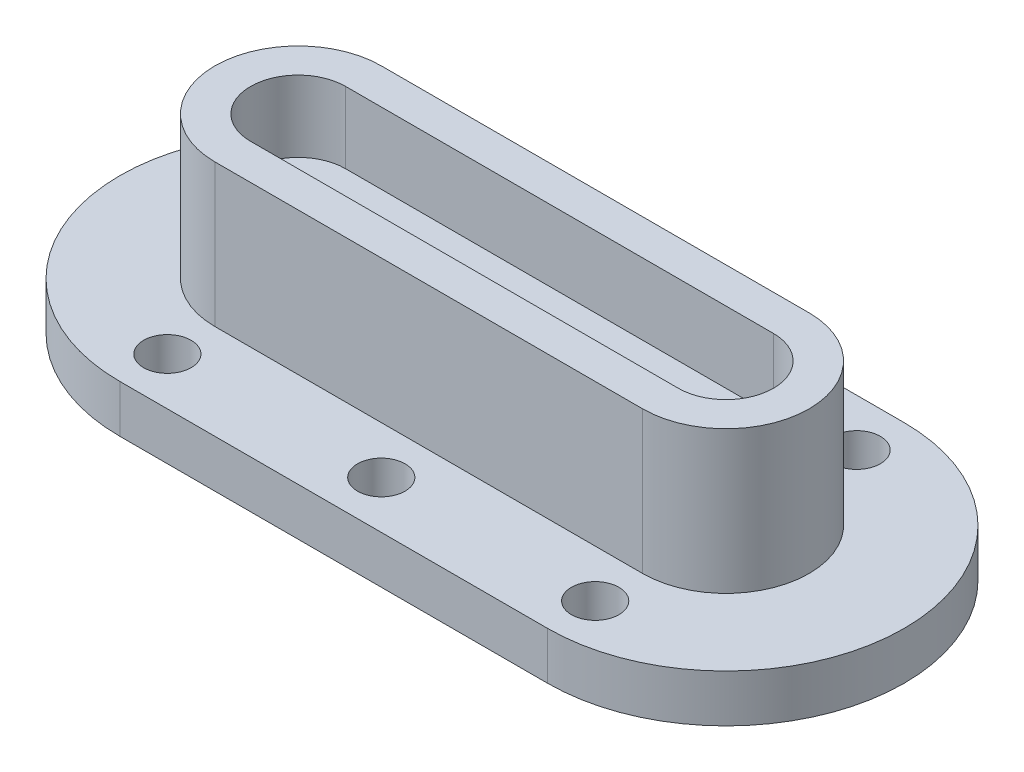
ISO-10303-21;
HEADER;
FILE_DESCRIPTION(('STEP AP214'),'2;1');
FILE_NAME('part.step','',(''),(''),'','','');
FILE_SCHEMA(('AUTOMOTIVE_DESIGN { 1 0 10303 214 1 1 1 1 }'));
ENDSEC;
DATA;
#1=APPLICATION_CONTEXT('core data for automotive mechanical design processes');
#2=APPLICATION_PROTOCOL_DEFINITION('international standard','automotive_design',2000,#1);
#3=PRODUCT_CONTEXT('',#1,'mechanical');
#4=PRODUCT('Part','Part','',(#3));
#5=PRODUCT_RELATED_PRODUCT_CATEGORY('part','',(#4));
#6=PRODUCT_DEFINITION_FORMATION('','',#4);
#7=PRODUCT_DEFINITION_CONTEXT('part definition',#1,'design');
#8=PRODUCT_DEFINITION('design','',#6,#7);
#9=PRODUCT_DEFINITION_SHAPE('','',#8);
#10=(LENGTH_UNIT() NAMED_UNIT(*) SI_UNIT(.MILLI.,.METRE.));
#11=(NAMED_UNIT(*) PLANE_ANGLE_UNIT() SI_UNIT($,.RADIAN.));
#12=(NAMED_UNIT(*) SI_UNIT($,.STERADIAN.) SOLID_ANGLE_UNIT());
#13=UNCERTAINTY_MEASURE_WITH_UNIT(LENGTH_MEASURE(1.E-05),#10,'distance_accuracy_value','');
#14=(GEOMETRIC_REPRESENTATION_CONTEXT(3) GLOBAL_UNCERTAINTY_ASSIGNED_CONTEXT((#13)) GLOBAL_UNIT_ASSIGNED_CONTEXT((#10,
#11,#12)) REPRESENTATION_CONTEXT('',''));
#15=CARTESIAN_POINT('',(0.,0.,0.));
#16=DIRECTION('',(0.,0.,1.));
#17=DIRECTION('',(1.,0.,0.));
#18=AXIS2_PLACEMENT_3D('',#15,#16,#17);
#19=CARTESIAN_POINT('',(0.,20.,-75.));
#20=DIRECTION('',(0.,0.,1.));
#21=DIRECTION('',(1.,0.,0.));
#22=AXIS2_PLACEMENT_3D('',#19,#20,#21);
#23=PLANE('',#22);
#24=DIRECTION('',(-1.,0.,0.));
#25=VECTOR('',#24,1.);
#26=CARTESIAN_POINT('',(0.,0.,-75.));
#27=LINE('',#26,#25);
#28=CARTESIAN_POINT('',(89.9999999999999,0.,-75.));
#29=VERTEX_POINT('',#28);
#30=CARTESIAN_POINT('',(-90.,0.,-75.));
#31=VERTEX_POINT('',#30);
#32=EDGE_CURVE('E262',#29,#31,#27,.T.);
#33=ORIENTED_EDGE('',*,*,#32,.T.);
#34=DIRECTION('',(0.,-1.,0.));
#35=VECTOR('',#34,1.);
#36=CARTESIAN_POINT('',(-90.,20.,-75.));
#37=LINE('',#36,#35);
#38=CARTESIAN_POINT('',(-90.,20.,-75.));
#39=VERTEX_POINT('',#38);
#40=EDGE_CURVE('E11',#39,#31,#37,.T.);
#41=ORIENTED_EDGE('',*,*,#40,.F.);
#42=DIRECTION('',(-1.,0.,0.));
#43=VECTOR('',#42,1.);
#44=CARTESIAN_POINT('',(0.,20.,-75.));
#45=LINE('',#44,#43);
#46=CARTESIAN_POINT('',(89.9999999999999,20.,-75.));
#47=VERTEX_POINT('',#46);
#48=EDGE_CURVE('E237',#47,#39,#45,.T.);
#49=ORIENTED_EDGE('',*,*,#48,.F.);
#50=DIRECTION('',(0.,-1.,0.));
#51=VECTOR('',#50,1.);
#52=CARTESIAN_POINT('',(89.9999999999999,20.,-75.));
#53=LINE('',#52,#51);
#54=EDGE_CURVE('E244',#47,#29,#53,.T.);
#55=ORIENTED_EDGE('',*,*,#54,.T.);
#56=EDGE_LOOP('',(#33,#41,#49,#55));
#57=FACE_BOUND('',#56,.T.);
#58=ADVANCED_FACE('F35',(#57),#23,.F.);
#59=CARTESIAN_POINT('',(-90.,20.,0.));
#60=DIRECTION('',(0.,-1.,0.));
#61=DIRECTION('',(0.,0.,-1.));
#62=AXIS2_PLACEMENT_3D('',#59,#60,#61);
#63=CYLINDRICAL_SURFACE('',#62,75.);
#64=CARTESIAN_POINT('',(-90.,0.,0.));
#65=DIRECTION('',(0.,1.,0.));
#66=DIRECTION('',(0.,0.,1.));
#67=AXIS2_PLACEMENT_3D('',#64,#65,#66);
#68=CIRCLE('',#67,75.);
#69=CARTESIAN_POINT('',(-90.,0.,75.));
#70=VERTEX_POINT('',#69);
#71=EDGE_CURVE('E265',#31,#70,#68,.T.);
#72=ORIENTED_EDGE('',*,*,#71,.T.);
#73=DIRECTION('',(0.,-1.,0.));
#74=VECTOR('',#73,1.);
#75=CARTESIAN_POINT('',(-90.,20.,75.));
#76=LINE('',#75,#74);
#77=CARTESIAN_POINT('',(-90.,20.,75.));
#78=VERTEX_POINT('',#77);
#79=EDGE_CURVE('E43',#78,#70,#76,.T.);
#80=ORIENTED_EDGE('',*,*,#79,.F.);
#81=CARTESIAN_POINT('',(-90.,20.,0.));
#82=DIRECTION('',(0.,1.,0.));
#83=DIRECTION('',(0.,0.,1.));
#84=AXIS2_PLACEMENT_3D('',#81,#82,#83);
#85=CIRCLE('',#84,75.);
#86=EDGE_CURVE('E87',#39,#78,#85,.T.);
#87=ORIENTED_EDGE('',*,*,#86,.F.);
#88=ORIENTED_EDGE('',*,*,#40,.T.);
#89=EDGE_LOOP('',(#72,#80,#87,#88));
#90=FACE_BOUND('',#89,.T.);
#91=ADVANCED_FACE('F285',(#90),#63,.T.);
#92=CARTESIAN_POINT('',(0.,20.,75.));
#93=DIRECTION('',(0.,0.,1.));
#94=DIRECTION('',(1.,0.,0.));
#95=AXIS2_PLACEMENT_3D('',#92,#93,#94);
#96=PLANE('',#95);
#97=DIRECTION('',(-1.,0.,0.));
#98=VECTOR('',#97,1.);
#99=CARTESIAN_POINT('',(0.,0.,75.));
#100=LINE('',#99,#98);
#101=CARTESIAN_POINT('',(90.,0.,75.));
#102=VERTEX_POINT('',#101);
#103=EDGE_CURVE('E268',#102,#70,#100,.T.);
#104=ORIENTED_EDGE('',*,*,#103,.F.);
#105=DIRECTION('',(0.,-1.,0.));
#106=VECTOR('',#105,1.);
#107=CARTESIAN_POINT('',(90.,20.,75.));
#108=LINE('',#107,#106);
#109=CARTESIAN_POINT('',(90.,20.,75.));
#110=VERTEX_POINT('',#109);
#111=EDGE_CURVE('E281',#110,#102,#108,.T.);
#112=ORIENTED_EDGE('',*,*,#111,.F.);
#113=DIRECTION('',(-1.,0.,0.));
#114=VECTOR('',#113,1.);
#115=CARTESIAN_POINT('',(0.,20.,75.));
#116=LINE('',#115,#114);
#117=EDGE_CURVE('E240',#110,#78,#116,.T.);
#118=ORIENTED_EDGE('',*,*,#117,.T.);
#119=ORIENTED_EDGE('',*,*,#79,.T.);
#120=EDGE_LOOP('',(#104,#112,#118,#119));
#121=FACE_BOUND('',#120,.T.);
#122=ADVANCED_FACE('F284',(#121),#96,.T.);
#123=CARTESIAN_POINT('',(0.,20.,6.05223092147341E-13));
#124=DIRECTION('',(0.,-1.,0.));
#125=DIRECTION('',(0.,0.,-1.));
#126=AXIS2_PLACEMENT_3D('',#123,#124,#125);
#127=CYLINDRICAL_SURFACE('',#126,7.50000000000001);
#128=CARTESIAN_POINT('',(0.,0.,6.05223092147341E-13));
#129=DIRECTION('',(0.,1.,0.));
#130=DIRECTION('',(0.,0.,1.));
#131=AXIS2_PLACEMENT_3D('',#128,#129,#130);
#132=CIRCLE('',#131,7.50000000000001);
#133=CARTESIAN_POINT('',(0.,0.,7.50000000000062));
#134=VERTEX_POINT('',#133);
#135=EDGE_CURVE('E275',#134,#134,#132,.T.);
#136=ORIENTED_EDGE('',*,*,#135,.F.);
#137=EDGE_LOOP('',(#136));
#138=FACE_BOUND('',#137,.T.);
#139=CARTESIAN_POINT('',(0.,50.,6.05223092147341E-13));
#140=DIRECTION('',(0.,1.,0.));
#141=DIRECTION('',(0.,0.,1.));
#142=AXIS2_PLACEMENT_3D('',#139,#140,#141);
#143=CIRCLE('',#142,7.50000000000001);
#144=CARTESIAN_POINT('',(0.,50.,7.50000000000062));
#145=VERTEX_POINT('',#144);
#146=EDGE_CURVE('E203',#145,#145,#143,.T.);
#147=ORIENTED_EDGE('',*,*,#146,.T.);
#148=EDGE_LOOP('',(#147));
#149=FACE_BOUND('',#148,.T.);
#150=ADVANCED_FACE('F504',(#138,#149),#127,.F.);
#151=CARTESIAN_POINT('',(-89.9999999999999,20.,1.2336897331391E-12));
#152=DIRECTION('',(0.,-1.,0.));
#153=DIRECTION('',(0.,0.,-1.));
#154=AXIS2_PLACEMENT_3D('',#151,#152,#153);
#155=CYLINDRICAL_SURFACE('',#154,7.50000000000001);
#156=CARTESIAN_POINT('',(-89.9999999999999,0.,1.2336897331391E-12));
#157=DIRECTION('',(0.,1.,0.));
#158=DIRECTION('',(0.,0.,1.));
#159=AXIS2_PLACEMENT_3D('',#156,#157,#158);
#160=CIRCLE('',#159,7.50000000000001);
#161=CARTESIAN_POINT('',(-89.9999999999999,0.,7.50000000000125));
#162=VERTEX_POINT('',#161);
#163=EDGE_CURVE('E272',#162,#162,#160,.T.);
#164=ORIENTED_EDGE('',*,*,#163,.F.);
#165=EDGE_LOOP('',(#164));
#166=FACE_BOUND('',#165,.T.);
#167=CARTESIAN_POINT('',(-89.9999999999999,50.,1.2336897331391E-12));
#168=DIRECTION('',(0.,1.,0.));
#169=DIRECTION('',(0.,0.,1.));
#170=AXIS2_PLACEMENT_3D('',#167,#168,#169);
#171=CIRCLE('',#170,7.50000000000001);
#172=CARTESIAN_POINT('',(-89.9999999999999,50.,7.50000000000125));
#173=VERTEX_POINT('',#172);
#174=EDGE_CURVE('E200',#173,#173,#171,.T.);
#175=ORIENTED_EDGE('',*,*,#174,.T.);
#176=EDGE_LOOP('',(#175));
#177=FACE_BOUND('',#176,.T.);
#178=ADVANCED_FACE('F383',(#166,#177),#155,.F.);
#179=CARTESIAN_POINT('',(90.,20.,0.));
#180=DIRECTION('',(0.,-1.,0.));
#181=DIRECTION('',(0.,0.,-1.));
#182=AXIS2_PLACEMENT_3D('',#179,#180,#181);
#183=CYLINDRICAL_SURFACE('',#182,75.);
#184=CARTESIAN_POINT('',(90.,0.,0.));
#185=DIRECTION('',(0.,1.,0.));
#186=DIRECTION('',(0.,0.,1.));
#187=AXIS2_PLACEMENT_3D('',#184,#185,#186);
#188=CIRCLE('',#187,75.);
#189=EDGE_CURVE('E80',#102,#29,#188,.T.);
#190=ORIENTED_EDGE('',*,*,#189,.T.);
#191=ORIENTED_EDGE('',*,*,#54,.F.);
#192=CARTESIAN_POINT('',(90.,20.,0.));
#193=DIRECTION('',(0.,1.,0.));
#194=DIRECTION('',(0.,0.,1.));
#195=AXIS2_PLACEMENT_3D('',#192,#193,#194);
#196=CIRCLE('',#195,75.);
#197=EDGE_CURVE('E59',#110,#47,#196,.T.);
#198=ORIENTED_EDGE('',*,*,#197,.F.);
#199=ORIENTED_EDGE('',*,*,#111,.T.);
#200=EDGE_LOOP('',(#190,#191,#198,#199));
#201=FACE_BOUND('',#200,.T.);
#202=ADVANCED_FACE('F293',(#201),#183,.T.);
#203=CARTESIAN_POINT('',(-90.0000000000002,20.,-55.));
#204=DIRECTION('',(0.,-1.,0.));
#205=DIRECTION('',(0.,0.,-1.));
#206=AXIS2_PLACEMENT_3D('',#203,#204,#205);
#207=CYLINDRICAL_SURFACE('',#206,9.99999999999999);
#208=CARTESIAN_POINT('',(-90.0000000000002,20.,-55.));
#209=DIRECTION('',(0.,1.,0.));
#210=DIRECTION('',(0.,0.,1.));
#211=AXIS2_PLACEMENT_3D('',#208,#209,#210);
#212=CIRCLE('',#211,9.99999999999999);
#213=CARTESIAN_POINT('',(-90.0000000000002,20.,-45.));
#214=VERTEX_POINT('',#213);
#215=EDGE_CURVE('E234',#214,#214,#212,.T.);
#216=ORIENTED_EDGE('',*,*,#215,.T.);
#217=EDGE_LOOP('',(#216));
#218=FACE_BOUND('',#217,.T.);
#219=CARTESIAN_POINT('',(-90.0000000000002,0.,-55.));
#220=DIRECTION('',(0.,1.,0.));
#221=DIRECTION('',(0.,0.,1.));
#222=AXIS2_PLACEMENT_3D('',#219,#220,#221);
#223=CIRCLE('',#222,9.99999999999999);
#224=CARTESIAN_POINT('',(-90.0000000000002,0.,-45.));
#225=VERTEX_POINT('',#224);
#226=EDGE_CURVE('E259',#225,#225,#223,.T.);
#227=ORIENTED_EDGE('',*,*,#226,.F.);
#228=EDGE_LOOP('',(#227));
#229=FACE_BOUND('',#228,.T.);
#230=ADVANCED_FACE('F318',(#218,#229),#207,.F.);
#231=CARTESIAN_POINT('',(-89.9999999999995,20.,55.));
#232=DIRECTION('',(0.,-1.,0.));
#233=DIRECTION('',(0.,0.,-1.));
#234=AXIS2_PLACEMENT_3D('',#231,#232,#233);
#235=CYLINDRICAL_SURFACE('',#234,10.);
#236=CARTESIAN_POINT('',(-89.9999999999995,20.,55.));
#237=DIRECTION('',(0.,1.,0.));
#238=DIRECTION('',(0.,0.,1.));
#239=AXIS2_PLACEMENT_3D('',#236,#237,#238);
#240=CIRCLE('',#239,10.);
#241=CARTESIAN_POINT('',(-89.9999999999995,20.,65.));
#242=VERTEX_POINT('',#241);
#243=EDGE_CURVE('E231',#242,#242,#240,.T.);
#244=ORIENTED_EDGE('',*,*,#243,.T.);
#245=EDGE_LOOP('',(#244));
#246=FACE_BOUND('',#245,.T.);
#247=CARTESIAN_POINT('',(-89.9999999999995,0.,55.));
#248=DIRECTION('',(0.,1.,0.));
#249=DIRECTION('',(0.,0.,1.));
#250=AXIS2_PLACEMENT_3D('',#247,#248,#249);
#251=CIRCLE('',#250,10.);
#252=CARTESIAN_POINT('',(-89.9999999999995,0.,65.));
#253=VERTEX_POINT('',#252);
#254=EDGE_CURVE('E256',#253,#253,#251,.T.);
#255=ORIENTED_EDGE('',*,*,#254,.F.);
#256=EDGE_LOOP('',(#255));
#257=FACE_BOUND('',#256,.T.);
#258=ADVANCED_FACE('F321',(#246,#257),#235,.F.);
#259=CARTESIAN_POINT('',(-1.94289029309402E-13,20.,-55.));
#260=DIRECTION('',(0.,-1.,0.));
#261=DIRECTION('',(0.,0.,-1.));
#262=AXIS2_PLACEMENT_3D('',#259,#260,#261);
#263=CYLINDRICAL_SURFACE('',#262,9.99999999999999);
#264=CARTESIAN_POINT('',(-1.94289029309402E-13,20.,-55.));
#265=DIRECTION('',(0.,1.,0.));
#266=DIRECTION('',(0.,0.,1.));
#267=AXIS2_PLACEMENT_3D('',#264,#265,#266);
#268=CIRCLE('',#267,9.99999999999999);
#269=CARTESIAN_POINT('',(-1.94289029309402E-13,20.,-45.));
#270=VERTEX_POINT('',#269);
#271=EDGE_CURVE('E228',#270,#270,#268,.T.);
#272=ORIENTED_EDGE('',*,*,#271,.T.);
#273=EDGE_LOOP('',(#272));
#274=FACE_BOUND('',#273,.T.);
#275=CARTESIAN_POINT('',(-1.94289029309402E-13,0.,-55.));
#276=DIRECTION('',(0.,1.,0.));
#277=DIRECTION('',(0.,0.,1.));
#278=AXIS2_PLACEMENT_3D('',#275,#276,#277);
#279=CIRCLE('',#278,9.99999999999999);
#280=CARTESIAN_POINT('',(-1.94289029309402E-13,0.,-45.));
#281=VERTEX_POINT('',#280);
#282=EDGE_CURVE('E253',#281,#281,#279,.T.);
#283=ORIENTED_EDGE('',*,*,#282,.F.);
#284=EDGE_LOOP('',(#283));
#285=FACE_BOUND('',#284,.T.);
#286=ADVANCED_FACE('F325',(#274,#285),#263,.F.);
#287=CARTESIAN_POINT('',(5.82867087928207E-13,20.,55.));
#288=DIRECTION('',(0.,-1.,0.));
#289=DIRECTION('',(0.,0.,-1.));
#290=AXIS2_PLACEMENT_3D('',#287,#288,#289);
#291=CYLINDRICAL_SURFACE('',#290,9.99999999999999);
#292=CARTESIAN_POINT('',(5.82867087928207E-13,20.,55.));
#293=DIRECTION('',(0.,1.,0.));
#294=DIRECTION('',(0.,0.,1.));
#295=AXIS2_PLACEMENT_3D('',#292,#293,#294);
#296=CIRCLE('',#295,9.99999999999999);
#297=CARTESIAN_POINT('',(5.82867087928207E-13,20.,65.));
#298=VERTEX_POINT('',#297);
#299=EDGE_CURVE('E225',#298,#298,#296,.T.);
#300=ORIENTED_EDGE('',*,*,#299,.T.);
#301=EDGE_LOOP('',(#300));
#302=FACE_BOUND('',#301,.T.);
#303=CARTESIAN_POINT('',(5.82867087928207E-13,0.,55.));
#304=DIRECTION('',(0.,1.,0.));
#305=DIRECTION('',(0.,0.,1.));
#306=AXIS2_PLACEMENT_3D('',#303,#304,#305);
#307=CIRCLE('',#306,9.99999999999999);
#308=CARTESIAN_POINT('',(5.82867087928207E-13,0.,65.));
#309=VERTEX_POINT('',#308);
#310=EDGE_CURVE('E250',#309,#309,#307,.T.);
#311=ORIENTED_EDGE('',*,*,#310,.F.);
#312=EDGE_LOOP('',(#311));
#313=FACE_BOUND('',#312,.T.);
#314=ADVANCED_FACE('F329',(#302,#313),#291,.F.);
#315=CARTESIAN_POINT('',(89.9999999999998,20.,-55.));
#316=DIRECTION('',(0.,-1.,0.));
#317=DIRECTION('',(0.,0.,-1.));
#318=AXIS2_PLACEMENT_3D('',#315,#316,#317);
#319=CYLINDRICAL_SURFACE('',#318,9.99999999999999);
#320=CARTESIAN_POINT('',(89.9999999999998,20.,-55.));
#321=DIRECTION('',(0.,1.,0.));
#322=DIRECTION('',(0.,0.,1.));
#323=AXIS2_PLACEMENT_3D('',#320,#321,#322);
#324=CIRCLE('',#323,9.99999999999999);
#325=CARTESIAN_POINT('',(89.9999999999998,20.,-45.));
#326=VERTEX_POINT('',#325);
#327=EDGE_CURVE('E221',#326,#326,#324,.T.);
#328=ORIENTED_EDGE('',*,*,#327,.T.);
#329=EDGE_LOOP('',(#328));
#330=FACE_BOUND('',#329,.T.);
#331=CARTESIAN_POINT('',(89.9999999999998,0.,-55.));
#332=DIRECTION('',(0.,1.,0.));
#333=DIRECTION('',(0.,0.,1.));
#334=AXIS2_PLACEMENT_3D('',#331,#332,#333);
#335=CIRCLE('',#334,9.99999999999999);
#336=CARTESIAN_POINT('',(89.9999999999998,0.,-45.));
#337=VERTEX_POINT('',#336);
#338=EDGE_CURVE('E247',#337,#337,#335,.T.);
#339=ORIENTED_EDGE('',*,*,#338,.F.);
#340=EDGE_LOOP('',(#339));
#341=FACE_BOUND('',#340,.T.);
#342=ADVANCED_FACE('F332',(#330,#341),#319,.F.);
#343=CARTESIAN_POINT('',(90.0000000000006,20.,55.));
#344=DIRECTION('',(0.,-1.,0.));
#345=DIRECTION('',(0.,0.,-1.));
#346=AXIS2_PLACEMENT_3D('',#343,#344,#345);
#347=CYLINDRICAL_SURFACE('',#346,9.99999999999999);
#348=CARTESIAN_POINT('',(90.0000000000006,20.,55.));
#349=DIRECTION('',(0.,1.,0.));
#350=DIRECTION('',(0.,0.,1.));
#351=AXIS2_PLACEMENT_3D('',#348,#349,#350);
#352=CIRCLE('',#351,9.99999999999999);
#353=CARTESIAN_POINT('',(90.0000000000006,20.,65.));
#354=VERTEX_POINT('',#353);
#355=EDGE_CURVE('E218',#354,#354,#352,.T.);
#356=ORIENTED_EDGE('',*,*,#355,.T.);
#357=EDGE_LOOP('',(#356));
#358=FACE_BOUND('',#357,.T.);
#359=CARTESIAN_POINT('',(90.0000000000006,0.,55.));
#360=DIRECTION('',(0.,1.,0.));
#361=DIRECTION('',(0.,0.,1.));
#362=AXIS2_PLACEMENT_3D('',#359,#360,#361);
#363=CIRCLE('',#362,9.99999999999999);
#364=CARTESIAN_POINT('',(90.0000000000006,0.,65.));
#365=VERTEX_POINT('',#364);
#366=EDGE_CURVE('E217',#365,#365,#363,.T.);
#367=ORIENTED_EDGE('',*,*,#366,.F.);
#368=EDGE_LOOP('',(#367));
#369=FACE_BOUND('',#368,.T.);
#370=ADVANCED_FACE('F37',(#358,#369),#347,.F.);
#371=CARTESIAN_POINT('',(90.0000000000001,20.,0.));
#372=DIRECTION('',(0.,-1.,0.));
#373=DIRECTION('',(0.,0.,-1.));
#374=AXIS2_PLACEMENT_3D('',#371,#372,#373);
#375=CYLINDRICAL_SURFACE('',#374,7.50000000000001);
#376=CARTESIAN_POINT('',(90.0000000000001,0.,0.));
#377=DIRECTION('',(0.,1.,0.));
#378=DIRECTION('',(0.,0.,1.));
#379=AXIS2_PLACEMENT_3D('',#376,#377,#378);
#380=CIRCLE('',#379,7.50000000000001);
#381=CARTESIAN_POINT('',(90.0000000000001,0.,7.49999999999999));
#382=VERTEX_POINT('',#381);
#383=EDGE_CURVE('E222',#382,#382,#380,.T.);
#384=ORIENTED_EDGE('',*,*,#383,.F.);
#385=EDGE_LOOP('',(#384));
#386=FACE_BOUND('',#385,.T.);
#387=CARTESIAN_POINT('',(90.0000000000001,50.,0.));
#388=DIRECTION('',(0.,1.,0.));
#389=DIRECTION('',(0.,0.,1.));
#390=AXIS2_PLACEMENT_3D('',#387,#388,#389);
#391=CIRCLE('',#390,7.50000000000001);
#392=CARTESIAN_POINT('',(90.0000000000001,50.,7.49999999999999));
#393=VERTEX_POINT('',#392);
#394=EDGE_CURVE('E206',#393,#393,#391,.T.);
#395=ORIENTED_EDGE('',*,*,#394,.T.);
#396=EDGE_LOOP('',(#395));
#397=FACE_BOUND('',#396,.T.);
#398=ADVANCED_FACE('F296',(#386,#397),#375,.F.);
#399=CARTESIAN_POINT('',(0.,20.,0.));
#400=DIRECTION('',(0.,1.,0.));
#401=DIRECTION('',(0.,0.,1.));
#402=AXIS2_PLACEMENT_3D('',#399,#400,#401);
#403=PLANE('',#402);
#404=CARTESIAN_POINT('',(-90.,20.,0.));
#405=DIRECTION('',(0.,1.,0.));
#406=DIRECTION('',(0.,0.,1.));
#407=AXIS2_PLACEMENT_3D('',#404,#405,#406);
#408=CIRCLE('',#407,35.);
#409=CARTESIAN_POINT('',(-90.,20.,35.));
#410=VERTEX_POINT('',#409);
#411=CARTESIAN_POINT('',(-90.,20.,-35.));
#412=VERTEX_POINT('',#411);
#413=EDGE_CURVE('E194',#410,#412,#408,.F.);
#414=ORIENTED_EDGE('',*,*,#413,.T.);
#415=DIRECTION('',(1.,0.,0.));
#416=VECTOR('',#415,1.);
#417=CARTESIAN_POINT('',(0.,20.,-35.));
#418=LINE('',#417,#416);
#419=CARTESIAN_POINT('',(90.,20.,-35.));
#420=VERTEX_POINT('',#419);
#421=EDGE_CURVE('E197',#412,#420,#418,.T.);
#422=ORIENTED_EDGE('',*,*,#421,.T.);
#423=CARTESIAN_POINT('',(90.,20.,0.));
#424=DIRECTION('',(0.,1.,0.));
#425=DIRECTION('',(0.,0.,1.));
#426=AXIS2_PLACEMENT_3D('',#423,#424,#425);
#427=CIRCLE('',#426,35.);
#428=CARTESIAN_POINT('',(90.,20.,35.));
#429=VERTEX_POINT('',#428);
#430=EDGE_CURVE('E184',#420,#429,#427,.F.);
#431=ORIENTED_EDGE('',*,*,#430,.T.);
#432=DIRECTION('',(1.,0.,0.));
#433=VECTOR('',#432,1.);
#434=CARTESIAN_POINT('',(0.,20.,35.));
#435=LINE('',#434,#433);
#436=EDGE_CURVE('E192',#410,#429,#435,.T.);
#437=ORIENTED_EDGE('',*,*,#436,.F.);
#438=EDGE_LOOP('',(#414,#422,#431,#437));
#439=FACE_BOUND('',#438,.T.);
#440=ORIENTED_EDGE('',*,*,#355,.F.);
#441=EDGE_LOOP('',(#440));
#442=FACE_BOUND('',#441,.T.);
#443=ORIENTED_EDGE('',*,*,#327,.F.);
#444=EDGE_LOOP('',(#443));
#445=FACE_BOUND('',#444,.T.);
#446=ORIENTED_EDGE('',*,*,#299,.F.);
#447=EDGE_LOOP('',(#446));
#448=FACE_BOUND('',#447,.T.);
#449=ORIENTED_EDGE('',*,*,#271,.F.);
#450=EDGE_LOOP('',(#449));
#451=FACE_BOUND('',#450,.T.);
#452=ORIENTED_EDGE('',*,*,#243,.F.);
#453=EDGE_LOOP('',(#452));
#454=FACE_BOUND('',#453,.T.);
#455=ORIENTED_EDGE('',*,*,#215,.F.);
#456=EDGE_LOOP('',(#455));
#457=FACE_BOUND('',#456,.T.);
#458=ORIENTED_EDGE('',*,*,#48,.T.);
#459=ORIENTED_EDGE('',*,*,#86,.T.);
#460=ORIENTED_EDGE('',*,*,#117,.F.);
#461=ORIENTED_EDGE('',*,*,#197,.T.);
#462=EDGE_LOOP('',(#458,#459,#460,#461));
#463=FACE_BOUND('',#462,.T.);
#464=ADVANCED_FACE('F294',(#439,#442,#445,#448,#451,#454,#457,#463),#403,.T.);
#465=CARTESIAN_POINT('',(0.,0.,0.));
#466=DIRECTION('',(0.,1.,0.));
#467=DIRECTION('',(0.,0.,1.));
#468=AXIS2_PLACEMENT_3D('',#465,#466,#467);
#469=PLANE('',#468);
#470=ORIENTED_EDGE('',*,*,#366,.T.);
#471=EDGE_LOOP('',(#470));
#472=FACE_BOUND('',#471,.T.);
#473=ORIENTED_EDGE('',*,*,#338,.T.);
#474=EDGE_LOOP('',(#473));
#475=FACE_BOUND('',#474,.T.);
#476=ORIENTED_EDGE('',*,*,#310,.T.);
#477=EDGE_LOOP('',(#476));
#478=FACE_BOUND('',#477,.T.);
#479=ORIENTED_EDGE('',*,*,#282,.T.);
#480=EDGE_LOOP('',(#479));
#481=FACE_BOUND('',#480,.T.);
#482=ORIENTED_EDGE('',*,*,#254,.T.);
#483=EDGE_LOOP('',(#482));
#484=FACE_BOUND('',#483,.T.);
#485=ORIENTED_EDGE('',*,*,#226,.T.);
#486=EDGE_LOOP('',(#485));
#487=FACE_BOUND('',#486,.T.);
#488=ORIENTED_EDGE('',*,*,#32,.F.);
#489=ORIENTED_EDGE('',*,*,#189,.F.);
#490=ORIENTED_EDGE('',*,*,#103,.T.);
#491=ORIENTED_EDGE('',*,*,#71,.F.);
#492=EDGE_LOOP('',(#488,#489,#490,#491));
#493=FACE_BOUND('',#492,.T.);
#494=ORIENTED_EDGE('',*,*,#383,.T.);
#495=EDGE_LOOP('',(#494));
#496=FACE_BOUND('',#495,.T.);
#497=ORIENTED_EDGE('',*,*,#135,.T.);
#498=EDGE_LOOP('',(#497));
#499=FACE_BOUND('',#498,.T.);
#500=ORIENTED_EDGE('',*,*,#163,.T.);
#501=EDGE_LOOP('',(#500));
#502=FACE_BOUND('',#501,.T.);
#503=ADVANCED_FACE('F289',(#472,#475,#478,#481,#484,#487,#493,#496,#499,#502),#469,.F.);
#504=CARTESIAN_POINT('',(0.,50.,0.));
#505=DIRECTION('',(0.,1.,0.));
#506=DIRECTION('',(0.,0.,1.));
#507=AXIS2_PLACEMENT_3D('',#504,#505,#506);
#508=PLANE('',#507);
#509=ORIENTED_EDGE('',*,*,#174,.F.);
#510=EDGE_LOOP('',(#509));
#511=FACE_BOUND('',#510,.T.);
#512=ORIENTED_EDGE('',*,*,#146,.F.);
#513=EDGE_LOOP('',(#512));
#514=FACE_BOUND('',#513,.T.);
#515=ORIENTED_EDGE('',*,*,#394,.F.);
#516=EDGE_LOOP('',(#515));
#517=FACE_BOUND('',#516,.T.);
#518=DIRECTION('',(-1.,0.,0.));
#519=VECTOR('',#518,1.);
#520=CARTESIAN_POINT('',(0.,50.,-20.));
#521=LINE('',#520,#519);
#522=CARTESIAN_POINT('',(90.,50.,-20.));
#523=VERTEX_POINT('',#522);
#524=CARTESIAN_POINT('',(-90.,50.,-20.));
#525=VERTEX_POINT('',#524);
#526=EDGE_CURVE('E209',#523,#525,#521,.T.);
#527=ORIENTED_EDGE('',*,*,#526,.T.);
#528=CARTESIAN_POINT('',(-90.,50.,0.));
#529=DIRECTION('',(0.,1.,0.));
#530=DIRECTION('',(0.,0.,1.));
#531=AXIS2_PLACEMENT_3D('',#528,#529,#530);
#532=CIRCLE('',#531,20.);
#533=CARTESIAN_POINT('',(-90.,50.,20.));
#534=VERTEX_POINT('',#533);
#535=EDGE_CURVE('E139',#525,#534,#532,.T.);
#536=ORIENTED_EDGE('',*,*,#535,.T.);
#537=DIRECTION('',(-1.,0.,0.));
#538=VECTOR('',#537,1.);
#539=CARTESIAN_POINT('',(0.,50.,20.));
#540=LINE('',#539,#538);
#541=CARTESIAN_POINT('',(90.,50.,20.));
#542=VERTEX_POINT('',#541);
#543=EDGE_CURVE('E212',#542,#534,#540,.T.);
#544=ORIENTED_EDGE('',*,*,#543,.F.);
#545=CARTESIAN_POINT('',(90.,50.,0.));
#546=DIRECTION('',(0.,1.,0.));
#547=DIRECTION('',(0.,0.,1.));
#548=AXIS2_PLACEMENT_3D('',#545,#546,#547);
#549=CIRCLE('',#548,20.);
#550=EDGE_CURVE('E215',#542,#523,#549,.T.);
#551=ORIENTED_EDGE('',*,*,#550,.T.);
#552=EDGE_LOOP('',(#527,#536,#544,#551));
#553=FACE_BOUND('',#552,.T.);
#554=ADVANCED_FACE('F303',(#511,#514,#517,#553),#508,.T.);
#555=CARTESIAN_POINT('',(0.,80.,-35.));
#556=DIRECTION('',(0.,0.,1.));
#557=DIRECTION('',(1.,0.,0.));
#558=AXIS2_PLACEMENT_3D('',#555,#556,#557);
#559=PLANE('',#558);
#560=ORIENTED_EDGE('',*,*,#421,.F.);
#561=DIRECTION('',(0.,-1.,0.));
#562=VECTOR('',#561,1.);
#563=CARTESIAN_POINT('',(-90.,80.,-35.));
#564=LINE('',#563,#562);
#565=CARTESIAN_POINT('',(-90.,80.,-35.));
#566=VERTEX_POINT('',#565);
#567=EDGE_CURVE('E181',#566,#412,#564,.T.);
#568=ORIENTED_EDGE('',*,*,#567,.F.);
#569=DIRECTION('',(-1.,0.,0.));
#570=VECTOR('',#569,1.);
#571=CARTESIAN_POINT('',(0.,80.,-35.));
#572=LINE('',#571,#570);
#573=CARTESIAN_POINT('',(90.,80.,-35.));
#574=VERTEX_POINT('',#573);
#575=EDGE_CURVE('E164',#574,#566,#572,.T.);
#576=ORIENTED_EDGE('',*,*,#575,.F.);
#577=DIRECTION('',(0.,-1.,0.));
#578=VECTOR('',#577,1.);
#579=CARTESIAN_POINT('',(90.,80.,-35.));
#580=LINE('',#579,#578);
#581=EDGE_CURVE('E143',#574,#420,#580,.T.);
#582=ORIENTED_EDGE('',*,*,#581,.T.);
#583=EDGE_LOOP('',(#560,#568,#576,#582));
#584=FACE_BOUND('',#583,.T.);
#585=ADVANCED_FACE('F403',(#584),#559,.F.);
#586=CARTESIAN_POINT('',(-90.,80.,0.));
#587=DIRECTION('',(0.,-1.,0.));
#588=DIRECTION('',(0.,0.,-1.));
#589=AXIS2_PLACEMENT_3D('',#586,#587,#588);
#590=CYLINDRICAL_SURFACE('',#589,35.);
#591=ORIENTED_EDGE('',*,*,#413,.F.);
#592=DIRECTION('',(0.,-1.,0.));
#593=VECTOR('',#592,1.);
#594=CARTESIAN_POINT('',(-90.,80.,35.));
#595=LINE('',#594,#593);
#596=CARTESIAN_POINT('',(-90.,80.,35.));
#597=VERTEX_POINT('',#596);
#598=EDGE_CURVE('E178',#597,#410,#595,.T.);
#599=ORIENTED_EDGE('',*,*,#598,.F.);
#600=CARTESIAN_POINT('',(-90.,80.,0.));
#601=DIRECTION('',(0.,1.,0.));
#602=DIRECTION('',(0.,0.,1.));
#603=AXIS2_PLACEMENT_3D('',#600,#601,#602);
#604=CIRCLE('',#603,35.);
#605=EDGE_CURVE('E167',#566,#597,#604,.T.);
#606=ORIENTED_EDGE('',*,*,#605,.F.);
#607=ORIENTED_EDGE('',*,*,#567,.T.);
#608=EDGE_LOOP('',(#591,#599,#606,#607));
#609=FACE_BOUND('',#608,.T.);
#610=ADVANCED_FACE('F412',(#609),#590,.T.);
#611=CARTESIAN_POINT('',(0.,80.,35.));
#612=DIRECTION('',(0.,0.,1.));
#613=DIRECTION('',(1.,0.,0.));
#614=AXIS2_PLACEMENT_3D('',#611,#612,#613);
#615=PLANE('',#614);
#616=ORIENTED_EDGE('',*,*,#598,.T.);
#617=ORIENTED_EDGE('',*,*,#436,.T.);
#618=DIRECTION('',(0.,-1.,0.));
#619=VECTOR('',#618,1.);
#620=CARTESIAN_POINT('',(90.,80.,35.));
#621=LINE('',#620,#619);
#622=CARTESIAN_POINT('',(90.,80.,35.));
#623=VERTEX_POINT('',#622);
#624=EDGE_CURVE('E50',#623,#429,#621,.T.);
#625=ORIENTED_EDGE('',*,*,#624,.F.);
#626=DIRECTION('',(-1.,0.,0.));
#627=VECTOR('',#626,1.);
#628=CARTESIAN_POINT('',(0.,80.,35.));
#629=LINE('',#628,#627);
#630=EDGE_CURVE('E169',#623,#597,#629,.T.);
#631=ORIENTED_EDGE('',*,*,#630,.T.);
#632=EDGE_LOOP('',(#616,#617,#625,#631));
#633=FACE_BOUND('',#632,.T.);
#634=ADVANCED_FACE('F422',(#633),#615,.T.);
#635=CARTESIAN_POINT('',(-90.,80.,0.));
#636=DIRECTION('',(0.,-1.,0.));
#637=DIRECTION('',(0.,0.,-1.));
#638=AXIS2_PLACEMENT_3D('',#635,#636,#637);
#639=CYLINDRICAL_SURFACE('',#638,20.);
#640=DIRECTION('',(0.,-1.,0.));
#641=VECTOR('',#640,1.);
#642=CARTESIAN_POINT('',(-90.,80.,20.));
#643=LINE('',#642,#641);
#644=CARTESIAN_POINT('',(-90.,80.,20.));
#645=VERTEX_POINT('',#644);
#646=EDGE_CURVE('E174',#645,#534,#643,.T.);
#647=ORIENTED_EDGE('',*,*,#646,.T.);
#648=ORIENTED_EDGE('',*,*,#535,.F.);
#649=DIRECTION('',(0.,-1.,0.));
#650=VECTOR('',#649,1.);
#651=CARTESIAN_POINT('',(-90.,80.,-20.));
#652=LINE('',#651,#650);
#653=CARTESIAN_POINT('',(-90.,80.,-20.));
#654=VERTEX_POINT('',#653);
#655=EDGE_CURVE('E134',#654,#525,#652,.T.);
#656=ORIENTED_EDGE('',*,*,#655,.F.);
#657=CARTESIAN_POINT('',(-90.,80.,0.));
#658=DIRECTION('',(0.,1.,0.));
#659=DIRECTION('',(0.,0.,1.));
#660=AXIS2_PLACEMENT_3D('',#657,#658,#659);
#661=CIRCLE('',#660,20.);
#662=EDGE_CURVE('E138',#654,#645,#661,.T.);
#663=ORIENTED_EDGE('',*,*,#662,.T.);
#664=EDGE_LOOP('',(#647,#648,#656,#663));
#665=FACE_BOUND('',#664,.T.);
#666=ADVANCED_FACE('F137',(#665),#639,.F.);
#667=CARTESIAN_POINT('',(0.,80.,-20.));
#668=DIRECTION('',(0.,0.,1.));
#669=DIRECTION('',(1.,0.,0.));
#670=AXIS2_PLACEMENT_3D('',#667,#668,#669);
#671=PLANE('',#670);
#672=ORIENTED_EDGE('',*,*,#655,.T.);
#673=ORIENTED_EDGE('',*,*,#526,.F.);
#674=DIRECTION('',(0.,-1.,0.));
#675=VECTOR('',#674,1.);
#676=CARTESIAN_POINT('',(90.,80.,-20.));
#677=LINE('',#676,#675);
#678=CARTESIAN_POINT('',(90.,80.,-20.));
#679=VERTEX_POINT('',#678);
#680=EDGE_CURVE('E144',#679,#523,#677,.T.);
#681=ORIENTED_EDGE('',*,*,#680,.F.);
#682=DIRECTION('',(-1.,0.,0.));
#683=VECTOR('',#682,1.);
#684=CARTESIAN_POINT('',(0.,80.,-20.));
#685=LINE('',#684,#683);
#686=EDGE_CURVE('E151',#679,#654,#685,.T.);
#687=ORIENTED_EDGE('',*,*,#686,.T.);
#688=EDGE_LOOP('',(#672,#673,#681,#687));
#689=FACE_BOUND('',#688,.T.);
#690=ADVANCED_FACE('F157',(#689),#671,.T.);
#691=CARTESIAN_POINT('',(90.,80.,0.));
#692=DIRECTION('',(0.,-1.,0.));
#693=DIRECTION('',(0.,0.,-1.));
#694=AXIS2_PLACEMENT_3D('',#691,#692,#693);
#695=CYLINDRICAL_SURFACE('',#694,20.);
#696=ORIENTED_EDGE('',*,*,#680,.T.);
#697=ORIENTED_EDGE('',*,*,#550,.F.);
#698=DIRECTION('',(0.,-1.,0.));
#699=VECTOR('',#698,1.);
#700=CARTESIAN_POINT('',(90.,80.,20.));
#701=LINE('',#700,#699);
#702=CARTESIAN_POINT('',(90.,80.,20.));
#703=VERTEX_POINT('',#702);
#704=EDGE_CURVE('E186',#703,#542,#701,.T.);
#705=ORIENTED_EDGE('',*,*,#704,.F.);
#706=CARTESIAN_POINT('',(90.,80.,0.));
#707=DIRECTION('',(0.,1.,0.));
#708=DIRECTION('',(0.,0.,1.));
#709=AXIS2_PLACEMENT_3D('',#706,#707,#708);
#710=CIRCLE('',#709,20.);
#711=EDGE_CURVE('E159',#703,#679,#710,.T.);
#712=ORIENTED_EDGE('',*,*,#711,.T.);
#713=EDGE_LOOP('',(#696,#697,#705,#712));
#714=FACE_BOUND('',#713,.T.);
#715=ADVANCED_FACE('F449',(#714),#695,.F.);
#716=CARTESIAN_POINT('',(0.,80.,20.));
#717=DIRECTION('',(0.,0.,1.));
#718=DIRECTION('',(1.,0.,0.));
#719=AXIS2_PLACEMENT_3D('',#716,#717,#718);
#720=PLANE('',#719);
#721=ORIENTED_EDGE('',*,*,#543,.T.);
#722=ORIENTED_EDGE('',*,*,#646,.F.);
#723=DIRECTION('',(-1.,0.,0.));
#724=VECTOR('',#723,1.);
#725=CARTESIAN_POINT('',(0.,80.,20.));
#726=LINE('',#725,#724);
#727=EDGE_CURVE('E154',#703,#645,#726,.T.);
#728=ORIENTED_EDGE('',*,*,#727,.F.);
#729=ORIENTED_EDGE('',*,*,#704,.T.);
#730=EDGE_LOOP('',(#721,#722,#728,#729));
#731=FACE_BOUND('',#730,.T.);
#732=ADVANCED_FACE('F458',(#731),#720,.F.);
#733=CARTESIAN_POINT('',(90.,80.,0.));
#734=DIRECTION('',(0.,-1.,0.));
#735=DIRECTION('',(0.,0.,-1.));
#736=AXIS2_PLACEMENT_3D('',#733,#734,#735);
#737=CYLINDRICAL_SURFACE('',#736,35.);
#738=ORIENTED_EDGE('',*,*,#430,.F.);
#739=ORIENTED_EDGE('',*,*,#581,.F.);
#740=CARTESIAN_POINT('',(90.,80.,0.));
#741=DIRECTION('',(0.,1.,0.));
#742=DIRECTION('',(0.,0.,1.));
#743=AXIS2_PLACEMENT_3D('',#740,#741,#742);
#744=CIRCLE('',#743,35.);
#745=EDGE_CURVE('E172',#623,#574,#744,.T.);
#746=ORIENTED_EDGE('',*,*,#745,.F.);
#747=ORIENTED_EDGE('',*,*,#624,.T.);
#748=EDGE_LOOP('',(#738,#739,#746,#747));
#749=FACE_BOUND('',#748,.T.);
#750=ADVANCED_FACE('F468',(#749),#737,.T.);
#751=CARTESIAN_POINT('',(0.,80.,0.));
#752=DIRECTION('',(0.,1.,0.));
#753=DIRECTION('',(0.,0.,1.));
#754=AXIS2_PLACEMENT_3D('',#751,#752,#753);
#755=PLANE('',#754);
#756=ORIENTED_EDGE('',*,*,#662,.F.);
#757=ORIENTED_EDGE('',*,*,#686,.F.);
#758=ORIENTED_EDGE('',*,*,#711,.F.);
#759=ORIENTED_EDGE('',*,*,#727,.T.);
#760=EDGE_LOOP('',(#756,#757,#758,#759));
#761=FACE_BOUND('',#760,.T.);
#762=ORIENTED_EDGE('',*,*,#575,.T.);
#763=ORIENTED_EDGE('',*,*,#605,.T.);
#764=ORIENTED_EDGE('',*,*,#630,.F.);
#765=ORIENTED_EDGE('',*,*,#745,.T.);
#766=EDGE_LOOP('',(#762,#763,#764,#765));
#767=FACE_BOUND('',#766,.T.);
#768=ADVANCED_FACE('F148',(#761,#767),#755,.T.);
#769=CLOSED_SHELL('',(#58,#91,#122,#150,#178,#202,#230,#258,#286,#314,#342,#370,#398,#464,#503,
#554,#585,#610,#634,#666,#690,#715,#732,#750,#768));
#770=MANIFOLD_SOLID_BREP('B2',#769);
#771=ADVANCED_BREP_SHAPE_REPRESENTATION('',(#18,#770),#14);
#772=SHAPE_DEFINITION_REPRESENTATION(#9,#771);
ENDSEC;
END-ISO-10303-21;
